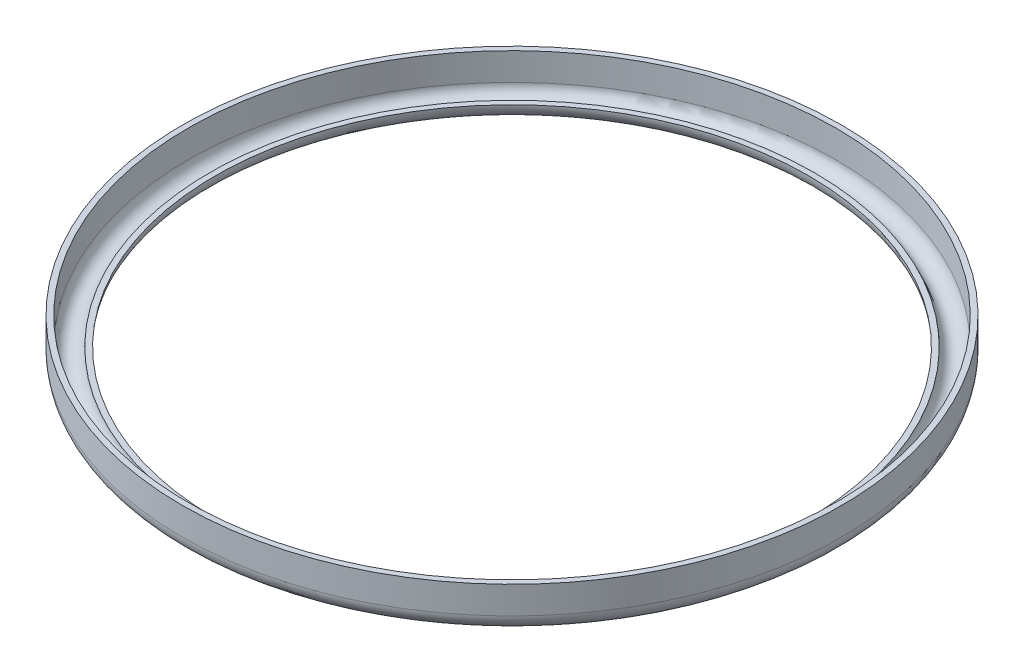
ISO-10303-21;
HEADER;
FILE_DESCRIPTION(('STEP AP214'),'2;1');
FILE_NAME('part.step','',(''),(''),'','','');
FILE_SCHEMA(('AUTOMOTIVE_DESIGN { 1 0 10303 214 1 1 1 1 }'));
ENDSEC;
DATA;
#1=APPLICATION_CONTEXT('core data for automotive mechanical design processes');
#2=APPLICATION_PROTOCOL_DEFINITION('international standard','automotive_design',2000,#1);
#3=PRODUCT_CONTEXT('',#1,'mechanical');
#4=PRODUCT('Part','Part','',(#3));
#5=PRODUCT_RELATED_PRODUCT_CATEGORY('part','',(#4));
#6=PRODUCT_DEFINITION_FORMATION('','',#4);
#7=PRODUCT_DEFINITION_CONTEXT('part definition',#1,'design');
#8=PRODUCT_DEFINITION('design','',#6,#7);
#9=PRODUCT_DEFINITION_SHAPE('','',#8);
#10=(LENGTH_UNIT() NAMED_UNIT(*) SI_UNIT(.MILLI.,.METRE.));
#11=(NAMED_UNIT(*) PLANE_ANGLE_UNIT() SI_UNIT($,.RADIAN.));
#12=(NAMED_UNIT(*) SI_UNIT($,.STERADIAN.) SOLID_ANGLE_UNIT());
#13=UNCERTAINTY_MEASURE_WITH_UNIT(LENGTH_MEASURE(1.E-05),#10,'distance_accuracy_value','');
#14=(GEOMETRIC_REPRESENTATION_CONTEXT(3) GLOBAL_UNCERTAINTY_ASSIGNED_CONTEXT((#13)) GLOBAL_UNIT_ASSIGNED_CONTEXT((#10,
#11,#12)) REPRESENTATION_CONTEXT('',''));
#15=CARTESIAN_POINT('',(0.,0.,0.));
#16=DIRECTION('',(0.,0.,1.));
#17=DIRECTION('',(1.,0.,0.));
#18=AXIS2_PLACEMENT_3D('',#15,#16,#17);
#19=CARTESIAN_POINT('',(0.,0.,0.));
#20=DIRECTION('',(0.,-1.,0.));
#21=DIRECTION('',(0.,0.,-1.));
#22=AXIS2_PLACEMENT_3D('',#19,#20,#21);
#23=TOROIDAL_SURFACE('',#22,57.,2.);
#24=CARTESIAN_POINT('',(0.,0.,0.));
#25=DIRECTION('',(0.,-1.,0.));
#26=DIRECTION('',(0.,0.,-1.));
#27=AXIS2_PLACEMENT_3D('',#24,#25,#26);
#28=CIRCLE('',#27,55.);
#29=CARTESIAN_POINT('',(0.,0.,-55.));
#30=VERTEX_POINT('',#29);
#31=EDGE_CURVE('E64',#30,#30,#28,.T.);
#32=ORIENTED_EDGE('',*,*,#31,.T.);
#33=EDGE_LOOP('',(#32));
#34=FACE_BOUND('',#33,.T.);
#35=CARTESIAN_POINT('',(0.,0.,0.));
#36=DIRECTION('',(0.,-1.,0.));
#37=DIRECTION('',(0.,0.,-1.));
#38=AXIS2_PLACEMENT_3D('',#35,#36,#37);
#39=CIRCLE('',#38,59.);
#40=CARTESIAN_POINT('',(0.,0.,-59.));
#41=VERTEX_POINT('',#40);
#42=EDGE_CURVE('E10',#41,#41,#39,.T.);
#43=ORIENTED_EDGE('',*,*,#42,.F.);
#44=EDGE_LOOP('',(#43));
#45=FACE_BOUND('',#44,.T.);
#46=ADVANCED_FACE('F41',(#34,#45),#23,.F.);
#47=CARTESIAN_POINT('',(0.,-17.0548985754703,0.));
#48=DIRECTION('',(0.,-1.,0.));
#49=DIRECTION('',(0.,0.,-1.));
#50=AXIS2_PLACEMENT_3D('',#47,#48,#49);
#51=CYLINDRICAL_SURFACE('',#50,59.);
#52=ORIENTED_EDGE('',*,*,#42,.T.);
#53=EDGE_LOOP('',(#52));
#54=FACE_BOUND('',#53,.T.);
#55=CARTESIAN_POINT('',(0.,4.99999999999999,0.));
#56=DIRECTION('',(0.,-1.,0.));
#57=DIRECTION('',(0.,0.,-1.));
#58=AXIS2_PLACEMENT_3D('',#55,#56,#57);
#59=CIRCLE('',#58,59.);
#60=CARTESIAN_POINT('',(0.,4.99999999999999,-59.));
#61=VERTEX_POINT('',#60);
#62=EDGE_CURVE('E50',#61,#61,#59,.T.);
#63=ORIENTED_EDGE('',*,*,#62,.F.);
#64=EDGE_LOOP('',(#63));
#65=FACE_BOUND('',#64,.T.);
#66=ADVANCED_FACE('F83',(#54,#65),#51,.F.);
#67=CARTESIAN_POINT('',(0.,4.99999999999999,0.));
#68=DIRECTION('',(0.,1.,0.));
#69=DIRECTION('',(0.,0.,1.));
#70=AXIS2_PLACEMENT_3D('',#67,#68,#69);
#71=PLANE('',#70);
#72=ORIENTED_EDGE('',*,*,#62,.T.);
#73=EDGE_LOOP('',(#72));
#74=FACE_BOUND('',#73,.T.);
#75=CARTESIAN_POINT('',(0.,4.99999999999999,0.));
#76=DIRECTION('',(0.,-1.,0.));
#77=DIRECTION('',(0.,0.,-1.));
#78=AXIS2_PLACEMENT_3D('',#75,#76,#77);
#79=CIRCLE('',#78,60.);
#80=CARTESIAN_POINT('',(0.,4.99999999999999,-60.));
#81=VERTEX_POINT('',#80);
#82=EDGE_CURVE('E51',#81,#81,#79,.T.);
#83=ORIENTED_EDGE('',*,*,#82,.F.);
#84=EDGE_LOOP('',(#83));
#85=FACE_BOUND('',#84,.T.);
#86=ADVANCED_FACE('F82',(#74,#85),#71,.T.);
#87=CARTESIAN_POINT('',(0.,-17.0548985754703,0.));
#88=DIRECTION('',(0.,-1.,0.));
#89=DIRECTION('',(0.,0.,-1.));
#90=AXIS2_PLACEMENT_3D('',#87,#88,#89);
#91=CYLINDRICAL_SURFACE('',#90,60.);
#92=CARTESIAN_POINT('',(0.,0.,0.));
#93=DIRECTION('',(0.,-1.,0.));
#94=DIRECTION('',(0.,0.,-1.));
#95=AXIS2_PLACEMENT_3D('',#92,#93,#94);
#96=CIRCLE('',#95,60.);
#97=CARTESIAN_POINT('',(0.,0.,-60.));
#98=VERTEX_POINT('',#97);
#99=EDGE_CURVE('E54',#98,#98,#96,.T.);
#100=ORIENTED_EDGE('',*,*,#99,.F.);
#101=EDGE_LOOP('',(#100));
#102=FACE_BOUND('',#101,.T.);
#103=ORIENTED_EDGE('',*,*,#82,.T.);
#104=EDGE_LOOP('',(#103));
#105=FACE_BOUND('',#104,.T.);
#106=ADVANCED_FACE('F77',(#102,#105),#91,.T.);
#107=CARTESIAN_POINT('',(0.,0.,0.));
#108=DIRECTION('',(0.,-1.,0.));
#109=DIRECTION('',(0.,0.,-1.));
#110=AXIS2_PLACEMENT_3D('',#107,#108,#109);
#111=TOROIDAL_SURFACE('',#110,57.,3.);
#112=CARTESIAN_POINT('',(0.,0.,0.));
#113=DIRECTION('',(0.,-1.,0.));
#114=DIRECTION('',(0.,0.,-1.));
#115=AXIS2_PLACEMENT_3D('',#112,#113,#114);
#116=CIRCLE('',#115,54.);
#117=CARTESIAN_POINT('',(0.,0.,-54.));
#118=VERTEX_POINT('',#117);
#119=EDGE_CURVE('E58',#118,#118,#116,.T.);
#120=ORIENTED_EDGE('',*,*,#119,.F.);
#121=EDGE_LOOP('',(#120));
#122=FACE_BOUND('',#121,.T.);
#123=ORIENTED_EDGE('',*,*,#99,.T.);
#124=EDGE_LOOP('',(#123));
#125=FACE_BOUND('',#124,.T.);
#126=ADVANCED_FACE('F71',(#122,#125),#111,.T.);
#127=CARTESIAN_POINT('',(0.,0.,0.));
#128=DIRECTION('',(0.,1.,0.));
#129=DIRECTION('',(0.,0.,1.));
#130=AXIS2_PLACEMENT_3D('',#127,#128,#129);
#131=PLANE('',#130);
#132=ORIENTED_EDGE('',*,*,#119,.T.);
#133=EDGE_LOOP('',(#132));
#134=FACE_BOUND('',#133,.T.);
#135=ORIENTED_EDGE('',*,*,#31,.F.);
#136=EDGE_LOOP('',(#135));
#137=FACE_BOUND('',#136,.T.);
#138=ADVANCED_FACE('F69',(#134,#137),#131,.T.);
#139=CLOSED_SHELL('',(#46,#66,#86,#106,#126,#138));
#140=MANIFOLD_SOLID_BREP('B2',#139);
#141=ADVANCED_BREP_SHAPE_REPRESENTATION('',(#18,#140),#14);
#142=SHAPE_DEFINITION_REPRESENTATION(#9,#141);
ENDSEC;
END-ISO-10303-21;
